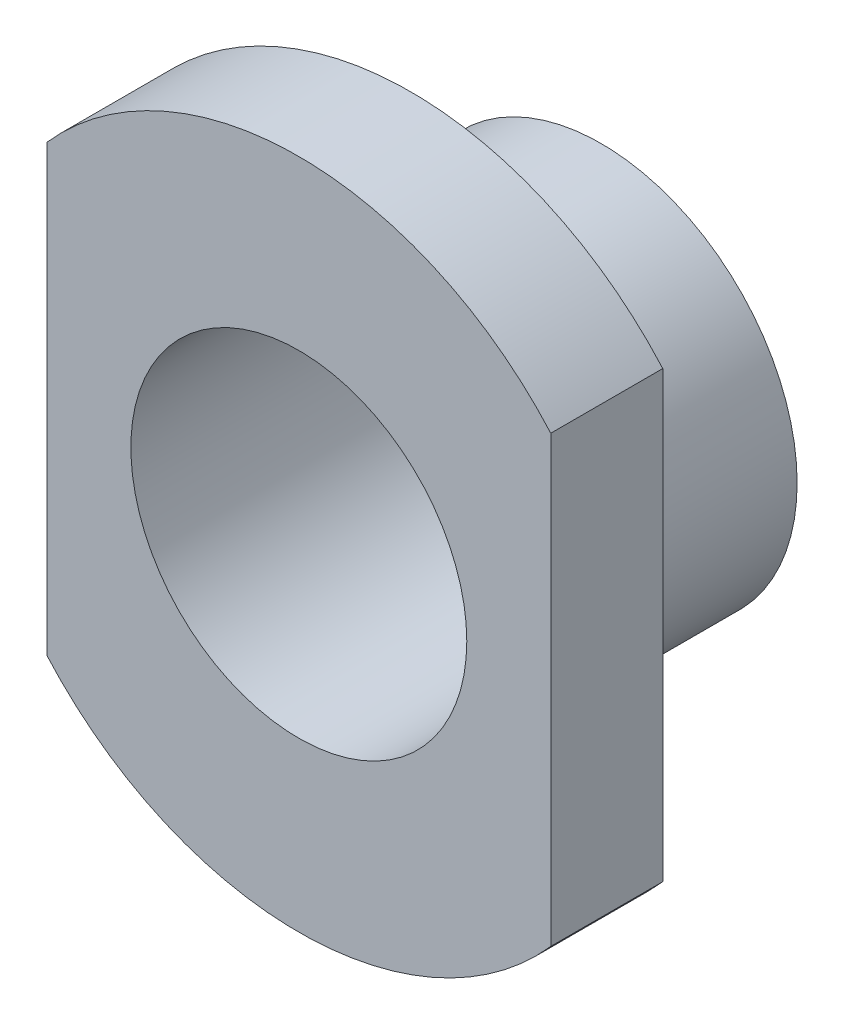
ISO-10303-21;
HEADER;
FILE_DESCRIPTION(('STEP AP214'),'2;1');
FILE_NAME('part.step','',(''),(''),'','','');
FILE_SCHEMA(('AUTOMOTIVE_DESIGN { 1 0 10303 214 1 1 1 1 }'));
ENDSEC;
DATA;
#1=APPLICATION_CONTEXT('core data for automotive mechanical design processes');
#2=APPLICATION_PROTOCOL_DEFINITION('international standard','automotive_design',2000,#1);
#3=PRODUCT_CONTEXT('',#1,'mechanical');
#4=PRODUCT('Part','Part','',(#3));
#5=PRODUCT_RELATED_PRODUCT_CATEGORY('part','',(#4));
#6=PRODUCT_DEFINITION_FORMATION('','',#4);
#7=PRODUCT_DEFINITION_CONTEXT('part definition',#1,'design');
#8=PRODUCT_DEFINITION('design','',#6,#7);
#9=PRODUCT_DEFINITION_SHAPE('','',#8);
#10=(LENGTH_UNIT() NAMED_UNIT(*) SI_UNIT(.MILLI.,.METRE.));
#11=(NAMED_UNIT(*) PLANE_ANGLE_UNIT() SI_UNIT($,.RADIAN.));
#12=(NAMED_UNIT(*) SI_UNIT($,.STERADIAN.) SOLID_ANGLE_UNIT());
#13=UNCERTAINTY_MEASURE_WITH_UNIT(LENGTH_MEASURE(1.E-05),#10,'distance_accuracy_value','');
#14=(GEOMETRIC_REPRESENTATION_CONTEXT(3) GLOBAL_UNCERTAINTY_ASSIGNED_CONTEXT((#13)) GLOBAL_UNIT_ASSIGNED_CONTEXT((#10,
#11,#12)) REPRESENTATION_CONTEXT('',''));
#15=CARTESIAN_POINT('',(0.,0.,0.));
#16=DIRECTION('',(0.,0.,1.));
#17=DIRECTION('',(1.,0.,0.));
#18=AXIS2_PLACEMENT_3D('',#15,#16,#17);
#19=CARTESIAN_POINT('',(0.,0.,0.));
#20=DIRECTION('',(0.,0.,1.));
#21=DIRECTION('',(1.,0.,0.));
#22=AXIS2_PLACEMENT_3D('',#19,#20,#21);
#23=PLANE('',#22);
#24=CARTESIAN_POINT('',(0.,0.,0.));
#25=DIRECTION('',(0.,0.,1.));
#26=DIRECTION('',(1.,0.,0.));
#27=AXIS2_PLACEMENT_3D('',#24,#25,#26);
#28=CIRCLE('',#27,1.75);
#29=CARTESIAN_POINT('',(1.75,0.,0.));
#30=VERTEX_POINT('',#29);
#31=EDGE_CURVE('E50',#30,#30,#28,.T.);
#32=ORIENTED_EDGE('',*,*,#31,.F.);
#33=EDGE_LOOP('',(#32));
#34=FACE_BOUND('',#33,.T.);
#35=CARTESIAN_POINT('',(0.,0.,0.));
#36=DIRECTION('',(0.,0.,1.));
#37=DIRECTION('',(1.,0.,0.));
#38=AXIS2_PLACEMENT_3D('',#35,#36,#37);
#39=CIRCLE('',#38,1.5);
#40=CARTESIAN_POINT('',(1.5,0.,0.));
#41=VERTEX_POINT('',#40);
#42=EDGE_CURVE('E125',#41,#41,#39,.T.);
#43=ORIENTED_EDGE('',*,*,#42,.T.);
#44=EDGE_LOOP('',(#43));
#45=FACE_BOUND('',#44,.T.);
#46=ADVANCED_FACE('F46',(#34,#45),#23,.F.);
#47=CARTESIAN_POINT('',(0.,0.,1.7));
#48=DIRECTION('',(0.,0.,-1.));
#49=DIRECTION('',(-1.,0.,0.));
#50=AXIS2_PLACEMENT_3D('',#47,#48,#49);
#51=CYLINDRICAL_SURFACE('',#50,1.75);
#52=CARTESIAN_POINT('',(0.,0.,1.7));
#53=DIRECTION('',(0.,0.,1.));
#54=DIRECTION('',(1.,0.,0.));
#55=AXIS2_PLACEMENT_3D('',#52,#53,#54);
#56=CIRCLE('',#55,1.75);
#57=CARTESIAN_POINT('',(1.75,0.,1.7));
#58=VERTEX_POINT('',#57);
#59=EDGE_CURVE('E13',#58,#58,#56,.T.);
#60=ORIENTED_EDGE('',*,*,#59,.F.);
#61=EDGE_LOOP('',(#60));
#62=FACE_BOUND('',#61,.T.);
#63=ORIENTED_EDGE('',*,*,#31,.T.);
#64=EDGE_LOOP('',(#63));
#65=FACE_BOUND('',#64,.T.);
#66=ADVANCED_FACE('F48',(#62,#65),#51,.T.);
#67=CARTESIAN_POINT('',(0.,0.,1.7));
#68=DIRECTION('',(0.,0.,-1.));
#69=DIRECTION('',(-1.,0.,0.));
#70=AXIS2_PLACEMENT_3D('',#67,#68,#69);
#71=CYLINDRICAL_SURFACE('',#70,1.5);
#72=ORIENTED_EDGE('',*,*,#42,.F.);
#73=EDGE_LOOP('',(#72));
#74=FACE_BOUND('',#73,.T.);
#75=CARTESIAN_POINT('',(0.,0.,2.7));
#76=DIRECTION('',(0.,0.,1.));
#77=DIRECTION('',(1.,0.,0.));
#78=AXIS2_PLACEMENT_3D('',#75,#76,#77);
#79=CIRCLE('',#78,1.5);
#80=CARTESIAN_POINT('',(1.5,0.,2.7));
#81=VERTEX_POINT('',#80);
#82=EDGE_CURVE('E110',#81,#81,#79,.F.);
#83=ORIENTED_EDGE('',*,*,#82,.F.);
#84=EDGE_LOOP('',(#83));
#85=FACE_BOUND('',#84,.T.);
#86=ADVANCED_FACE('F137',(#74,#85),#71,.F.);
#87=CARTESIAN_POINT('',(2.25,0.,2.7));
#88=DIRECTION('',(-1.,0.,0.));
#89=DIRECTION('',(0.,0.,1.));
#90=AXIS2_PLACEMENT_3D('',#87,#88,#89);
#91=PLANE('',#90);
#92=DIRECTION('',(0.,1.,0.));
#93=VECTOR('',#92,1.);
#94=CARTESIAN_POINT('',(2.25,0.,1.7));
#95=LINE('',#94,#93);
#96=CARTESIAN_POINT('',(2.25,-1.98431348329844,1.7));
#97=VERTEX_POINT('',#96);
#98=CARTESIAN_POINT('',(2.25,1.98431348329844,1.7));
#99=VERTEX_POINT('',#98);
#100=EDGE_CURVE('E116',#97,#99,#95,.T.);
#101=ORIENTED_EDGE('',*,*,#100,.T.);
#102=DIRECTION('',(0.,0.,-1.));
#103=VECTOR('',#102,1.);
#104=CARTESIAN_POINT('',(2.25,1.98431348329844,2.7));
#105=LINE('',#104,#103);
#106=CARTESIAN_POINT('',(2.25,1.98431348329844,2.7));
#107=VERTEX_POINT('',#106);
#108=EDGE_CURVE('E106',#107,#99,#105,.T.);
#109=ORIENTED_EDGE('',*,*,#108,.F.);
#110=DIRECTION('',(0.,1.,0.));
#111=VECTOR('',#110,1.);
#112=CARTESIAN_POINT('',(2.25,0.,2.7));
#113=LINE('',#112,#111);
#114=CARTESIAN_POINT('',(2.25,-1.98431348329844,2.7));
#115=VERTEX_POINT('',#114);
#116=EDGE_CURVE('E96',#115,#107,#113,.T.);
#117=ORIENTED_EDGE('',*,*,#116,.F.);
#118=DIRECTION('',(0.,0.,-1.));
#119=VECTOR('',#118,1.);
#120=CARTESIAN_POINT('',(2.25,-1.98431348329844,2.7));
#121=LINE('',#120,#119);
#122=EDGE_CURVE('E115',#115,#97,#121,.T.);
#123=ORIENTED_EDGE('',*,*,#122,.T.);
#124=EDGE_LOOP('',(#101,#109,#117,#123));
#125=FACE_BOUND('',#124,.T.);
#126=ADVANCED_FACE('F142',(#125),#91,.F.);
#127=CARTESIAN_POINT('',(0.,0.,2.7));
#128=DIRECTION('',(0.,0.,-1.));
#129=DIRECTION('',(-1.,0.,0.));
#130=AXIS2_PLACEMENT_3D('',#127,#128,#129);
#131=CYLINDRICAL_SURFACE('',#130,3.);
#132=CARTESIAN_POINT('',(0.,0.,1.7));
#133=DIRECTION('',(0.,0.,1.));
#134=DIRECTION('',(1.,0.,0.));
#135=AXIS2_PLACEMENT_3D('',#132,#133,#134);
#136=CIRCLE('',#135,3.);
#137=CARTESIAN_POINT('',(-2.25,1.98431348329844,1.7));
#138=VERTEX_POINT('',#137);
#139=EDGE_CURVE('E102',#99,#138,#136,.T.);
#140=ORIENTED_EDGE('',*,*,#139,.T.);
#141=DIRECTION('',(0.,0.,-1.));
#142=VECTOR('',#141,1.);
#143=CARTESIAN_POINT('',(-2.25,1.98431348329844,2.7));
#144=LINE('',#143,#142);
#145=CARTESIAN_POINT('',(-2.25,1.98431348329844,2.7));
#146=VERTEX_POINT('',#145);
#147=EDGE_CURVE('E100',#146,#138,#144,.T.);
#148=ORIENTED_EDGE('',*,*,#147,.F.);
#149=CARTESIAN_POINT('',(0.,0.,2.7));
#150=DIRECTION('',(0.,0.,1.));
#151=DIRECTION('',(1.,0.,0.));
#152=AXIS2_PLACEMENT_3D('',#149,#150,#151);
#153=CIRCLE('',#152,3.);
#154=EDGE_CURVE('E90',#107,#146,#153,.T.);
#155=ORIENTED_EDGE('',*,*,#154,.F.);
#156=ORIENTED_EDGE('',*,*,#108,.T.);
#157=EDGE_LOOP('',(#140,#148,#155,#156));
#158=FACE_BOUND('',#157,.T.);
#159=ADVANCED_FACE('F101',(#158),#131,.T.);
#160=CARTESIAN_POINT('',(-2.25,0.,2.7));
#161=DIRECTION('',(-1.,0.,0.));
#162=DIRECTION('',(0.,0.,1.));
#163=AXIS2_PLACEMENT_3D('',#160,#161,#162);
#164=PLANE('',#163);
#165=DIRECTION('',(0.,1.,0.));
#166=VECTOR('',#165,1.);
#167=CARTESIAN_POINT('',(-2.25,0.,1.7));
#168=LINE('',#167,#166);
#169=CARTESIAN_POINT('',(-2.25,-1.98431348329844,1.7));
#170=VERTEX_POINT('',#169);
#171=EDGE_CURVE('E120',#170,#138,#168,.T.);
#172=ORIENTED_EDGE('',*,*,#171,.F.);
#173=DIRECTION('',(0.,0.,-1.));
#174=VECTOR('',#173,1.);
#175=CARTESIAN_POINT('',(-2.25,-1.98431348329844,2.7));
#176=LINE('',#175,#174);
#177=CARTESIAN_POINT('',(-2.25,-1.98431348329844,2.7));
#178=VERTEX_POINT('',#177);
#179=EDGE_CURVE('E79',#178,#170,#176,.T.);
#180=ORIENTED_EDGE('',*,*,#179,.F.);
#181=DIRECTION('',(0.,1.,0.));
#182=VECTOR('',#181,1.);
#183=CARTESIAN_POINT('',(-2.25,0.,2.7));
#184=LINE('',#183,#182);
#185=EDGE_CURVE('E94',#178,#146,#184,.T.);
#186=ORIENTED_EDGE('',*,*,#185,.T.);
#187=ORIENTED_EDGE('',*,*,#147,.T.);
#188=EDGE_LOOP('',(#172,#180,#186,#187));
#189=FACE_BOUND('',#188,.T.);
#190=ADVANCED_FACE('F108',(#189),#164,.T.);
#191=EDGE_CURVE('E82',#170,#97,#136,.T.);
#192=ORIENTED_EDGE('',*,*,#191,.T.);
#193=ORIENTED_EDGE('',*,*,#122,.F.);
#194=EDGE_CURVE('E63',#178,#115,#153,.T.);
#195=ORIENTED_EDGE('',*,*,#194,.F.);
#196=ORIENTED_EDGE('',*,*,#179,.T.);
#197=EDGE_LOOP('',(#192,#193,#195,#196));
#198=FACE_BOUND('',#197,.T.);
#199=ADVANCED_FACE('F149',(#198),#131,.T.);
#200=CARTESIAN_POINT('',(0.,0.,2.7));
#201=DIRECTION('',(0.,0.,1.));
#202=DIRECTION('',(1.,0.,0.));
#203=AXIS2_PLACEMENT_3D('',#200,#201,#202);
#204=PLANE('',#203);
#205=ORIENTED_EDGE('',*,*,#116,.T.);
#206=ORIENTED_EDGE('',*,*,#154,.T.);
#207=ORIENTED_EDGE('',*,*,#185,.F.);
#208=ORIENTED_EDGE('',*,*,#194,.T.);
#209=EDGE_LOOP('',(#205,#206,#207,#208));
#210=FACE_BOUND('',#209,.T.);
#211=ORIENTED_EDGE('',*,*,#82,.T.);
#212=EDGE_LOOP('',(#211));
#213=FACE_BOUND('',#212,.T.);
#214=ADVANCED_FACE('F91',(#210,#213),#204,.T.);
#215=CARTESIAN_POINT('',(0.,0.,1.7));
#216=DIRECTION('',(0.,0.,1.));
#217=DIRECTION('',(1.,0.,0.));
#218=AXIS2_PLACEMENT_3D('',#215,#216,#217);
#219=PLANE('',#218);
#220=ORIENTED_EDGE('',*,*,#59,.T.);
#221=EDGE_LOOP('',(#220));
#222=FACE_BOUND('',#221,.T.);
#223=ORIENTED_EDGE('',*,*,#100,.F.);
#224=ORIENTED_EDGE('',*,*,#191,.F.);
#225=ORIENTED_EDGE('',*,*,#171,.T.);
#226=ORIENTED_EDGE('',*,*,#139,.F.);
#227=EDGE_LOOP('',(#223,#224,#225,#226));
#228=FACE_BOUND('',#227,.T.);
#229=ADVANCED_FACE('F152',(#222,#228),#219,.F.);
#230=CLOSED_SHELL('',(#46,#66,#86,#126,#159,#190,#199,#214,#229));
#231=MANIFOLD_SOLID_BREP('B2',#230);
#232=ADVANCED_BREP_SHAPE_REPRESENTATION('',(#18,#231),#14);
#233=SHAPE_DEFINITION_REPRESENTATION(#9,#232);
ENDSEC;
END-ISO-10303-21;
